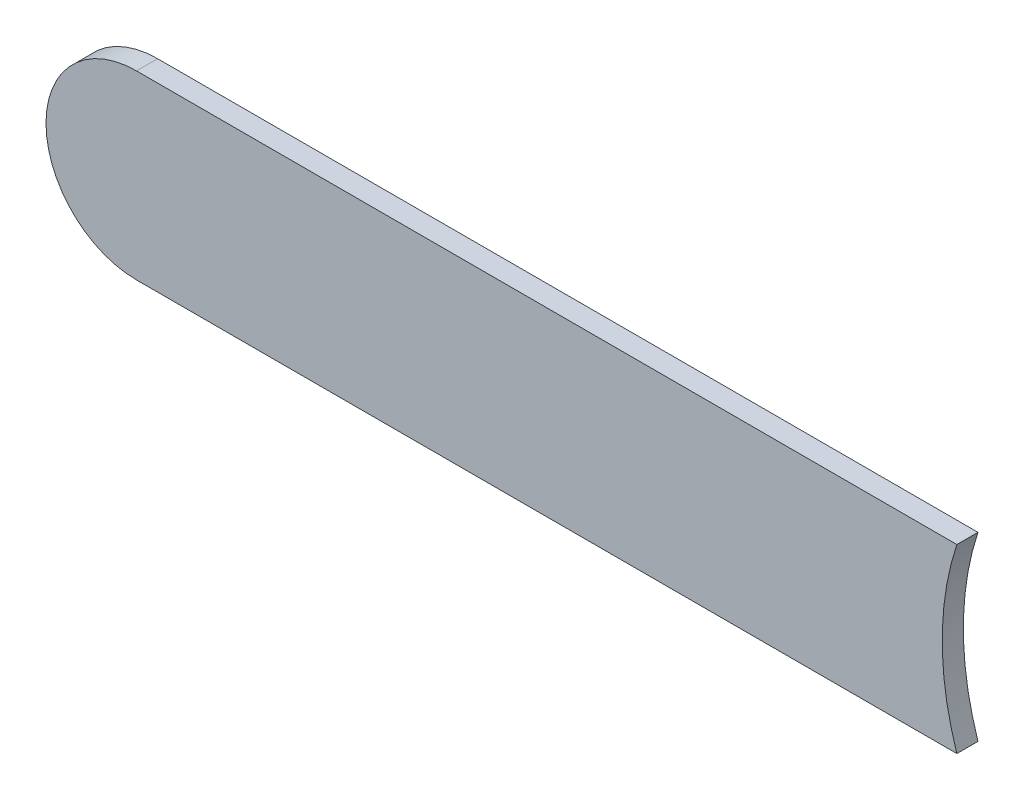
ISO-10303-21;
HEADER;
FILE_DESCRIPTION(('STEP AP214'),'2;1');
FILE_NAME('part.step','',(''),(''),'','','');
FILE_SCHEMA(('AUTOMOTIVE_DESIGN { 1 0 10303 214 1 1 1 1 }'));
ENDSEC;
DATA;
#1=APPLICATION_CONTEXT('core data for automotive mechanical design processes');
#2=APPLICATION_PROTOCOL_DEFINITION('international standard','automotive_design',2000,#1);
#3=PRODUCT_CONTEXT('',#1,'mechanical');
#4=PRODUCT('Part','Part','',(#3));
#5=PRODUCT_RELATED_PRODUCT_CATEGORY('part','',(#4));
#6=PRODUCT_DEFINITION_FORMATION('','',#4);
#7=PRODUCT_DEFINITION_CONTEXT('part definition',#1,'design');
#8=PRODUCT_DEFINITION('design','',#6,#7);
#9=PRODUCT_DEFINITION_SHAPE('','',#8);
#10=(LENGTH_UNIT() NAMED_UNIT(*) SI_UNIT(.MILLI.,.METRE.));
#11=(NAMED_UNIT(*) PLANE_ANGLE_UNIT() SI_UNIT($,.RADIAN.));
#12=(NAMED_UNIT(*) SI_UNIT($,.STERADIAN.) SOLID_ANGLE_UNIT());
#13=UNCERTAINTY_MEASURE_WITH_UNIT(LENGTH_MEASURE(1.E-05),#10,'distance_accuracy_value','');
#14=(GEOMETRIC_REPRESENTATION_CONTEXT(3) GLOBAL_UNCERTAINTY_ASSIGNED_CONTEXT((#13)) GLOBAL_UNIT_ASSIGNED_CONTEXT((#10,
#11,#12)) REPRESENTATION_CONTEXT('',''));
#15=CARTESIAN_POINT('',(0.,0.,0.));
#16=DIRECTION('',(0.,0.,1.));
#17=DIRECTION('',(1.,0.,0.));
#18=AXIS2_PLACEMENT_3D('',#15,#16,#17);
#19=CARTESIAN_POINT('',(162.7,-70.8,1.6));
#20=DIRECTION('',(0.,-1.,0.));
#21=DIRECTION('',(0.,0.,-1.));
#22=AXIS2_PLACEMENT_3D('',#19,#20,#21);
#23=PLANE('',#22);
#24=DIRECTION('',(0.,0.,1.));
#25=VECTOR('',#24,1.);
#26=CARTESIAN_POINT('',(160.89,-70.8,1.6));
#27=LINE('',#26,#25);
#28=CARTESIAN_POINT('',(160.89,-70.8,1.6));
#29=VERTEX_POINT('',#28);
#30=CARTESIAN_POINT('',(160.89,-70.8,1.635));
#31=VERTEX_POINT('',#30);
#32=EDGE_CURVE('E11',#29,#31,#27,.T.);
#33=ORIENTED_EDGE('',*,*,#32,.T.);
#34=DIRECTION('',(-1.,0.,0.));
#35=VECTOR('',#34,1.);
#36=CARTESIAN_POINT('',(162.7,-70.8,1.635));
#37=LINE('',#36,#35);
#38=CARTESIAN_POINT('',(162.24930609056,-70.8,1.635));
#39=VERTEX_POINT('',#38);
#40=EDGE_CURVE('E25',#39,#31,#37,.T.);
#41=ORIENTED_EDGE('',*,*,#40,.F.);
#42=DIRECTION('',(0.,0.,-1.));
#43=VECTOR('',#42,1.);
#44=CARTESIAN_POINT('',(162.24930609056,-70.8,-0.045));
#45=LINE('',#44,#43);
#46=CARTESIAN_POINT('',(162.24930609056,-70.8,1.6));
#47=VERTEX_POINT('',#46);
#48=EDGE_CURVE('E72',#39,#47,#45,.T.);
#49=ORIENTED_EDGE('',*,*,#48,.T.);
#50=DIRECTION('',(-1.,0.,0.));
#51=VECTOR('',#50,1.);
#52=CARTESIAN_POINT('',(162.7,-70.8,1.6));
#53=LINE('',#52,#51);
#54=EDGE_CURVE('E105',#47,#29,#53,.T.);
#55=ORIENTED_EDGE('',*,*,#54,.T.);
#56=EDGE_LOOP('',(#33,#41,#49,#55));
#57=FACE_BOUND('',#56,.T.);
#58=ADVANCED_FACE('F17',(#57),#23,.F.);
#59=CARTESIAN_POINT('',(160.89,-70.95,1.6));
#60=DIRECTION('',(0.,0.,-1.));
#61=DIRECTION('',(-1.894780628694E-13,1.,0.));
#62=AXIS2_PLACEMENT_3D('',#59,#60,#61);
#63=CYLINDRICAL_SURFACE('',#62,0.15);
#64=CARTESIAN_POINT('',(160.89,-70.95,1.6));
#65=DIRECTION('',(0.,0.,1.));
#66=DIRECTION('',(-1.894780628694E-13,1.,0.));
#67=AXIS2_PLACEMENT_3D('',#64,#65,#66);
#68=CIRCLE('',#67,0.15);
#69=CARTESIAN_POINT('',(160.89,-71.1,1.6));
#70=VERTEX_POINT('',#69);
#71=EDGE_CURVE('E75',#29,#70,#68,.T.);
#72=ORIENTED_EDGE('',*,*,#71,.T.);
#73=DIRECTION('',(0.,0.,1.));
#74=VECTOR('',#73,1.);
#75=CARTESIAN_POINT('',(160.89,-71.1,1.6));
#76=LINE('',#75,#74);
#77=CARTESIAN_POINT('',(160.89,-71.1,1.635));
#78=VERTEX_POINT('',#77);
#79=EDGE_CURVE('E86',#70,#78,#76,.T.);
#80=ORIENTED_EDGE('',*,*,#79,.T.);
#81=CARTESIAN_POINT('',(160.89,-70.95,1.635));
#82=DIRECTION('',(0.,0.,1.));
#83=DIRECTION('',(-1.894780628694E-13,1.,0.));
#84=AXIS2_PLACEMENT_3D('',#81,#82,#83);
#85=CIRCLE('',#84,0.15);
#86=EDGE_CURVE('E81',#31,#78,#85,.T.);
#87=ORIENTED_EDGE('',*,*,#86,.F.);
#88=ORIENTED_EDGE('',*,*,#32,.F.);
#89=EDGE_LOOP('',(#72,#80,#87,#88));
#90=FACE_BOUND('',#89,.T.);
#91=ADVANCED_FACE('F120',(#90),#63,.T.);
#92=CARTESIAN_POINT('',(160.89,-71.1,1.635));
#93=DIRECTION('',(0.,0.,1.));
#94=DIRECTION('',(1.,0.,0.));
#95=AXIS2_PLACEMENT_3D('',#92,#93,#94);
#96=PLANE('',#95);
#97=ORIENTED_EDGE('',*,*,#86,.T.);
#98=DIRECTION('',(1.,0.,0.));
#99=VECTOR('',#98,1.);
#100=CARTESIAN_POINT('',(160.89,-71.1,1.635));
#101=LINE('',#100,#99);
#102=CARTESIAN_POINT('',(162.24930609057,-71.1,1.635));
#103=VERTEX_POINT('',#102);
#104=EDGE_CURVE('E78',#78,#103,#101,.T.);
#105=ORIENTED_EDGE('',*,*,#104,.T.);
#106=CARTESIAN_POINT('',(162.7,-70.95,1.635));
#107=DIRECTION('',(0.,0.,-1.));
#108=DIRECTION('',(0.,-1.,0.));
#109=AXIS2_PLACEMENT_3D('',#106,#107,#108);
#110=CIRCLE('',#109,0.475);
#111=EDGE_CURVE('E66',#103,#39,#110,.T.);
#112=ORIENTED_EDGE('',*,*,#111,.T.);
#113=ORIENTED_EDGE('',*,*,#40,.T.);
#114=EDGE_LOOP('',(#97,#105,#112,#113));
#115=FACE_BOUND('',#114,.T.);
#116=ADVANCED_FACE('F79',(#115),#96,.T.);
#117=CARTESIAN_POINT('',(162.7,-70.95,-0.045));
#118=DIRECTION('',(0.,0.,-1.));
#119=DIRECTION('',(0.,-1.,0.));
#120=AXIS2_PLACEMENT_3D('',#117,#118,#119);
#121=CYLINDRICAL_SURFACE('',#120,0.475);
#122=ORIENTED_EDGE('',*,*,#111,.F.);
#123=DIRECTION('',(0.,0.,-1.));
#124=VECTOR('',#123,1.);
#125=CARTESIAN_POINT('',(162.24930609056,-71.1,-0.045));
#126=LINE('',#125,#124);
#127=CARTESIAN_POINT('',(162.24930609057,-71.1,1.6));
#128=VERTEX_POINT('',#127);
#129=EDGE_CURVE('E71',#103,#128,#126,.T.);
#130=ORIENTED_EDGE('',*,*,#129,.T.);
#131=CARTESIAN_POINT('',(162.7,-70.95,1.6));
#132=DIRECTION('',(0.,0.,-1.));
#133=DIRECTION('',(0.,-1.,0.));
#134=AXIS2_PLACEMENT_3D('',#131,#132,#133);
#135=CIRCLE('',#134,0.475);
#136=EDGE_CURVE('E108',#128,#47,#135,.T.);
#137=ORIENTED_EDGE('',*,*,#136,.T.);
#138=ORIENTED_EDGE('',*,*,#48,.F.);
#139=EDGE_LOOP('',(#122,#130,#137,#138));
#140=FACE_BOUND('',#139,.T.);
#141=ADVANCED_FACE('F68',(#140),#121,.F.);
#142=CARTESIAN_POINT('',(160.89,-71.1,1.6));
#143=DIRECTION('',(0.,0.,1.));
#144=DIRECTION('',(1.,0.,0.));
#145=AXIS2_PLACEMENT_3D('',#142,#143,#144);
#146=PLANE('',#145);
#147=ORIENTED_EDGE('',*,*,#54,.F.);
#148=ORIENTED_EDGE('',*,*,#136,.F.);
#149=DIRECTION('',(1.,0.,0.));
#150=VECTOR('',#149,1.);
#151=CARTESIAN_POINT('',(160.89,-71.1,1.6));
#152=LINE('',#151,#150);
#153=EDGE_CURVE('E91',#70,#128,#152,.T.);
#154=ORIENTED_EDGE('',*,*,#153,.F.);
#155=ORIENTED_EDGE('',*,*,#71,.F.);
#156=EDGE_LOOP('',(#147,#148,#154,#155));
#157=FACE_BOUND('',#156,.T.);
#158=ADVANCED_FACE('F118',(#157),#146,.F.);
#159=CARTESIAN_POINT('',(160.89,-71.1,1.6));
#160=DIRECTION('',(0.,1.,0.));
#161=DIRECTION('',(1.,0.,0.));
#162=AXIS2_PLACEMENT_3D('',#159,#160,#161);
#163=PLANE('',#162);
#164=ORIENTED_EDGE('',*,*,#129,.F.);
#165=ORIENTED_EDGE('',*,*,#104,.F.);
#166=ORIENTED_EDGE('',*,*,#79,.F.);
#167=ORIENTED_EDGE('',*,*,#153,.T.);
#168=EDGE_LOOP('',(#164,#165,#166,#167));
#169=FACE_BOUND('',#168,.T.);
#170=ADVANCED_FACE('F89',(#169),#163,.F.);
#171=CLOSED_SHELL('',(#58,#91,#116,#141,#158,#170));
#172=MANIFOLD_SOLID_BREP('B1',#171);
#173=ADVANCED_BREP_SHAPE_REPRESENTATION('',(#18,#172),#14);
#174=SHAPE_DEFINITION_REPRESENTATION(#9,#173);
ENDSEC;
END-ISO-10303-21;
